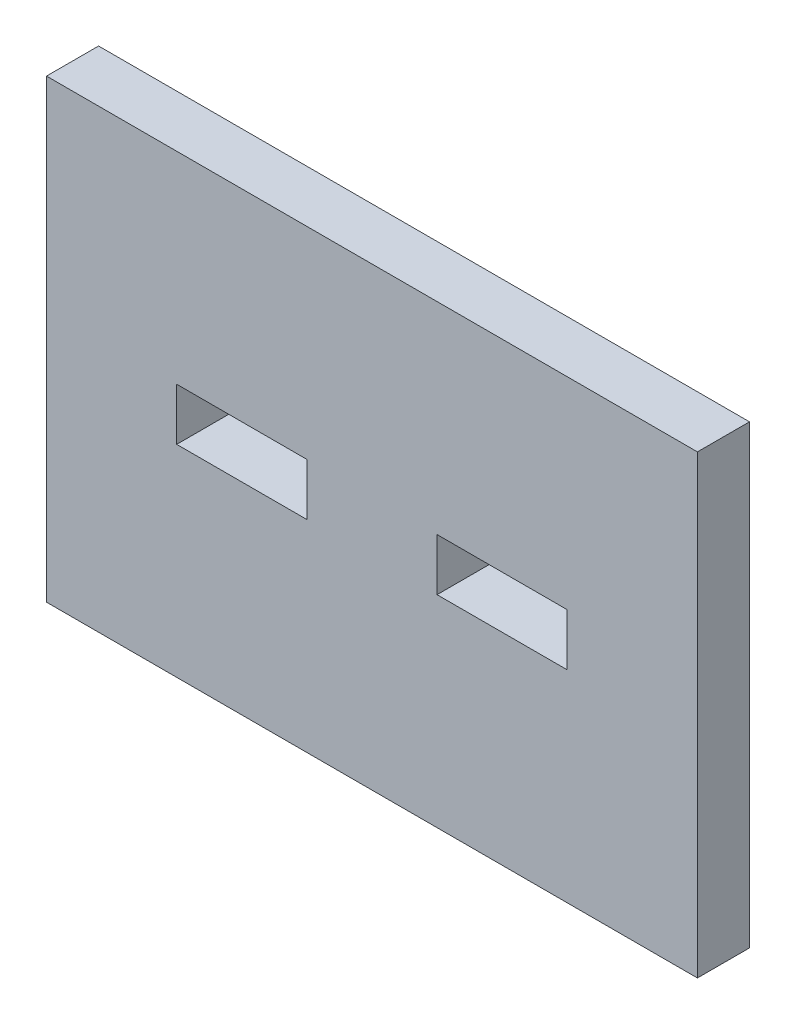
ISO-10303-21;
HEADER;
FILE_DESCRIPTION(('STEP AP214'),'2;1');
FILE_NAME('part.step','',(''),(''),'','','');
FILE_SCHEMA(('AUTOMOTIVE_DESIGN { 1 0 10303 214 1 1 1 1 }'));
ENDSEC;
DATA;
#1=APPLICATION_CONTEXT('core data for automotive mechanical design processes');
#2=APPLICATION_PROTOCOL_DEFINITION('international standard','automotive_design',2000,#1);
#3=PRODUCT_CONTEXT('',#1,'mechanical');
#4=PRODUCT('Part','Part','',(#3));
#5=PRODUCT_RELATED_PRODUCT_CATEGORY('part','',(#4));
#6=PRODUCT_DEFINITION_FORMATION('','',#4);
#7=PRODUCT_DEFINITION_CONTEXT('part definition',#1,'design');
#8=PRODUCT_DEFINITION('design','',#6,#7);
#9=PRODUCT_DEFINITION_SHAPE('','',#8);
#10=(LENGTH_UNIT() NAMED_UNIT(*) SI_UNIT(.MILLI.,.METRE.));
#11=(NAMED_UNIT(*) PLANE_ANGLE_UNIT() SI_UNIT($,.RADIAN.));
#12=(NAMED_UNIT(*) SI_UNIT($,.STERADIAN.) SOLID_ANGLE_UNIT());
#13=UNCERTAINTY_MEASURE_WITH_UNIT(LENGTH_MEASURE(1.E-05),#10,'distance_accuracy_value','');
#14=(GEOMETRIC_REPRESENTATION_CONTEXT(3) GLOBAL_UNCERTAINTY_ASSIGNED_CONTEXT((#13)) GLOBAL_UNIT_ASSIGNED_CONTEXT((#10,
#11,#12)) REPRESENTATION_CONTEXT('',''));
#15=CARTESIAN_POINT('',(0.,0.,0.));
#16=DIRECTION('',(0.,0.,1.));
#17=DIRECTION('',(1.,0.,0.));
#18=AXIS2_PLACEMENT_3D('',#15,#16,#17);
#19=CARTESIAN_POINT('',(0.,0.,4.));
#20=DIRECTION('',(1.,0.,0.));
#21=DIRECTION('',(0.,0.,-1.));
#22=AXIS2_PLACEMENT_3D('',#19,#20,#21);
#23=PLANE('',#22);
#24=DIRECTION('',(0.,-1.,0.));
#25=VECTOR('',#24,1.);
#26=CARTESIAN_POINT('',(0.,0.,0.));
#27=LINE('',#26,#25);
#28=CARTESIAN_POINT('',(0.,35.,0.));
#29=VERTEX_POINT('',#28);
#30=CARTESIAN_POINT('',(0.,0.,0.));
#31=VERTEX_POINT('',#30);
#32=EDGE_CURVE('E181',#29,#31,#27,.T.);
#33=ORIENTED_EDGE('',*,*,#32,.T.);
#34=DIRECTION('',(0.,0.,-1.));
#35=VECTOR('',#34,1.);
#36=CARTESIAN_POINT('',(0.,0.,4.));
#37=LINE('',#36,#35);
#38=CARTESIAN_POINT('',(0.,0.,4.));
#39=VERTEX_POINT('',#38);
#40=EDGE_CURVE('E11',#39,#31,#37,.T.);
#41=ORIENTED_EDGE('',*,*,#40,.F.);
#42=DIRECTION('',(0.,-1.,0.));
#43=VECTOR('',#42,1.);
#44=CARTESIAN_POINT('',(0.,0.,4.));
#45=LINE('',#44,#43);
#46=CARTESIAN_POINT('',(0.,35.,4.));
#47=VERTEX_POINT('',#46);
#48=EDGE_CURVE('E188',#47,#39,#45,.T.);
#49=ORIENTED_EDGE('',*,*,#48,.F.);
#50=DIRECTION('',(0.,0.,-1.));
#51=VECTOR('',#50,1.);
#52=CARTESIAN_POINT('',(0.,35.,4.));
#53=LINE('',#52,#51);
#54=EDGE_CURVE('E198',#47,#29,#53,.T.);
#55=ORIENTED_EDGE('',*,*,#54,.T.);
#56=EDGE_LOOP('',(#33,#41,#49,#55));
#57=FACE_BOUND('',#56,.T.);
#58=ADVANCED_FACE('F31',(#57),#23,.F.);
#59=CARTESIAN_POINT('',(0.,0.,4.));
#60=DIRECTION('',(0.,1.,0.));
#61=DIRECTION('',(0.,0.,1.));
#62=AXIS2_PLACEMENT_3D('',#59,#60,#61);
#63=PLANE('',#62);
#64=DIRECTION('',(1.,0.,0.));
#65=VECTOR('',#64,1.);
#66=CARTESIAN_POINT('',(0.,0.,0.));
#67=LINE('',#66,#65);
#68=CARTESIAN_POINT('',(50.,0.,0.));
#69=VERTEX_POINT('',#68);
#70=EDGE_CURVE('E201',#31,#69,#67,.T.);
#71=ORIENTED_EDGE('',*,*,#70,.T.);
#72=DIRECTION('',(0.,0.,-1.));
#73=VECTOR('',#72,1.);
#74=CARTESIAN_POINT('',(50.,0.,4.));
#75=LINE('',#74,#73);
#76=CARTESIAN_POINT('',(50.,0.,4.));
#77=VERTEX_POINT('',#76);
#78=EDGE_CURVE('E38',#77,#69,#75,.T.);
#79=ORIENTED_EDGE('',*,*,#78,.F.);
#80=DIRECTION('',(1.,0.,0.));
#81=VECTOR('',#80,1.);
#82=CARTESIAN_POINT('',(0.,0.,4.));
#83=LINE('',#82,#81);
#84=EDGE_CURVE('E191',#39,#77,#83,.T.);
#85=ORIENTED_EDGE('',*,*,#84,.F.);
#86=ORIENTED_EDGE('',*,*,#40,.T.);
#87=EDGE_LOOP('',(#71,#79,#85,#86));
#88=FACE_BOUND('',#87,.T.);
#89=ADVANCED_FACE('F230',(#88),#63,.F.);
#90=CARTESIAN_POINT('',(50.,0.,4.));
#91=DIRECTION('',(-1.,0.,0.));
#92=DIRECTION('',(0.,0.,1.));
#93=AXIS2_PLACEMENT_3D('',#90,#91,#92);
#94=PLANE('',#93);
#95=DIRECTION('',(0.,1.,0.));
#96=VECTOR('',#95,1.);
#97=CARTESIAN_POINT('',(50.,0.,0.));
#98=LINE('',#97,#96);
#99=CARTESIAN_POINT('',(50.,35.,0.));
#100=VERTEX_POINT('',#99);
#101=EDGE_CURVE('E203',#69,#100,#98,.T.);
#102=ORIENTED_EDGE('',*,*,#101,.T.);
#103=DIRECTION('',(0.,0.,-1.));
#104=VECTOR('',#103,1.);
#105=CARTESIAN_POINT('',(50.,35.,4.));
#106=LINE('',#105,#104);
#107=CARTESIAN_POINT('',(50.,35.,4.));
#108=VERTEX_POINT('',#107);
#109=EDGE_CURVE('E208',#108,#100,#106,.T.);
#110=ORIENTED_EDGE('',*,*,#109,.F.);
#111=DIRECTION('',(0.,1.,0.));
#112=VECTOR('',#111,1.);
#113=CARTESIAN_POINT('',(50.,0.,4.));
#114=LINE('',#113,#112);
#115=EDGE_CURVE('E194',#77,#108,#114,.T.);
#116=ORIENTED_EDGE('',*,*,#115,.F.);
#117=ORIENTED_EDGE('',*,*,#78,.T.);
#118=EDGE_LOOP('',(#102,#110,#116,#117));
#119=FACE_BOUND('',#118,.T.);
#120=ADVANCED_FACE('F215',(#119),#94,.F.);
#121=CARTESIAN_POINT('',(0.,35.,4.));
#122=DIRECTION('',(0.,-1.,0.));
#123=DIRECTION('',(0.,0.,-1.));
#124=AXIS2_PLACEMENT_3D('',#121,#122,#123);
#125=PLANE('',#124);
#126=DIRECTION('',(-1.,0.,0.));
#127=VECTOR('',#126,1.);
#128=CARTESIAN_POINT('',(0.,35.,0.));
#129=LINE('',#128,#127);
#130=EDGE_CURVE('E192',#100,#29,#129,.T.);
#131=ORIENTED_EDGE('',*,*,#130,.T.);
#132=ORIENTED_EDGE('',*,*,#54,.F.);
#133=DIRECTION('',(-1.,0.,0.));
#134=VECTOR('',#133,1.);
#135=CARTESIAN_POINT('',(0.,35.,4.));
#136=LINE('',#135,#134);
#137=EDGE_CURVE('E196',#108,#47,#136,.T.);
#138=ORIENTED_EDGE('',*,*,#137,.F.);
#139=ORIENTED_EDGE('',*,*,#109,.T.);
#140=EDGE_LOOP('',(#131,#132,#138,#139));
#141=FACE_BOUND('',#140,.T.);
#142=ADVANCED_FACE('F223',(#141),#125,.F.);
#143=CARTESIAN_POINT('',(0.,35.,4.));
#144=DIRECTION('',(0.,0.,-1.));
#145=DIRECTION('',(-1.,0.,0.));
#146=AXIS2_PLACEMENT_3D('',#143,#144,#145);
#147=PLANE('',#146);
#148=DIRECTION('',(-1.,0.,0.));
#149=VECTOR('',#148,1.);
#150=CARTESIAN_POINT('',(30.,19.5,4.));
#151=LINE('',#150,#149);
#152=CARTESIAN_POINT('',(40.,19.5,4.));
#153=VERTEX_POINT('',#152);
#154=CARTESIAN_POINT('',(30.,19.5,4.));
#155=VERTEX_POINT('',#154);
#156=EDGE_CURVE('E146',#153,#155,#151,.T.);
#157=ORIENTED_EDGE('',*,*,#156,.F.);
#158=DIRECTION('',(0.,1.,0.));
#159=VECTOR('',#158,1.);
#160=CARTESIAN_POINT('',(40.,19.5,4.));
#161=LINE('',#160,#159);
#162=CARTESIAN_POINT('',(40.,15.5,4.));
#163=VERTEX_POINT('',#162);
#164=EDGE_CURVE('E45',#163,#153,#161,.T.);
#165=ORIENTED_EDGE('',*,*,#164,.F.);
#166=DIRECTION('',(1.,0.,0.));
#167=VECTOR('',#166,1.);
#168=CARTESIAN_POINT('',(30.,15.5,4.));
#169=LINE('',#168,#167);
#170=CARTESIAN_POINT('',(30.,15.5,4.));
#171=VERTEX_POINT('',#170);
#172=EDGE_CURVE('E137',#171,#163,#169,.T.);
#173=ORIENTED_EDGE('',*,*,#172,.F.);
#174=DIRECTION('',(0.,-1.,0.));
#175=VECTOR('',#174,1.);
#176=CARTESIAN_POINT('',(30.,19.5,4.));
#177=LINE('',#176,#175);
#178=EDGE_CURVE('E140',#155,#171,#177,.T.);
#179=ORIENTED_EDGE('',*,*,#178,.F.);
#180=EDGE_LOOP('',(#157,#165,#173,#179));
#181=FACE_BOUND('',#180,.T.);
#182=DIRECTION('',(-1.,0.,0.));
#183=VECTOR('',#182,1.);
#184=CARTESIAN_POINT('',(10.,19.5,4.));
#185=LINE('',#184,#183);
#186=CARTESIAN_POINT('',(20.,19.5,4.));
#187=VERTEX_POINT('',#186);
#188=CARTESIAN_POINT('',(10.,19.5,4.));
#189=VERTEX_POINT('',#188);
#190=EDGE_CURVE('E171',#187,#189,#185,.T.);
#191=ORIENTED_EDGE('',*,*,#190,.F.);
#192=DIRECTION('',(0.,1.,0.));
#193=VECTOR('',#192,1.);
#194=CARTESIAN_POINT('',(20.,19.5,4.));
#195=LINE('',#194,#193);
#196=CARTESIAN_POINT('',(20.,15.5,4.));
#197=VERTEX_POINT('',#196);
#198=EDGE_CURVE('E152',#197,#187,#195,.T.);
#199=ORIENTED_EDGE('',*,*,#198,.F.);
#200=DIRECTION('',(1.,0.,0.));
#201=VECTOR('',#200,1.);
#202=CARTESIAN_POINT('',(10.,15.5,4.));
#203=LINE('',#202,#201);
#204=CARTESIAN_POINT('',(10.,15.5,4.));
#205=VERTEX_POINT('',#204);
#206=EDGE_CURVE('E160',#205,#197,#203,.T.);
#207=ORIENTED_EDGE('',*,*,#206,.F.);
#208=DIRECTION('',(0.,-1.,0.));
#209=VECTOR('',#208,1.);
#210=CARTESIAN_POINT('',(10.,19.5,4.));
#211=LINE('',#210,#209);
#212=EDGE_CURVE('E174',#189,#205,#211,.T.);
#213=ORIENTED_EDGE('',*,*,#212,.F.);
#214=EDGE_LOOP('',(#191,#199,#207,#213));
#215=FACE_BOUND('',#214,.T.);
#216=ORIENTED_EDGE('',*,*,#48,.T.);
#217=ORIENTED_EDGE('',*,*,#84,.T.);
#218=ORIENTED_EDGE('',*,*,#115,.T.);
#219=ORIENTED_EDGE('',*,*,#137,.T.);
#220=EDGE_LOOP('',(#216,#217,#218,#219));
#221=FACE_BOUND('',#220,.T.);
#222=ADVANCED_FACE('F229',(#181,#215,#221),#147,.F.);
#223=CARTESIAN_POINT('',(0.,35.,0.));
#224=DIRECTION('',(0.,0.,-1.));
#225=DIRECTION('',(-1.,0.,0.));
#226=AXIS2_PLACEMENT_3D('',#223,#224,#225);
#227=PLANE('',#226);
#228=DIRECTION('',(0.,1.,0.));
#229=VECTOR('',#228,1.);
#230=CARTESIAN_POINT('',(40.,19.5,0.));
#231=LINE('',#230,#229);
#232=CARTESIAN_POINT('',(40.,15.5,0.));
#233=VERTEX_POINT('',#232);
#234=CARTESIAN_POINT('',(40.,19.5,0.));
#235=VERTEX_POINT('',#234);
#236=EDGE_CURVE('E121',#233,#235,#231,.T.);
#237=ORIENTED_EDGE('',*,*,#236,.T.);
#238=DIRECTION('',(-1.,0.,0.));
#239=VECTOR('',#238,1.);
#240=CARTESIAN_POINT('',(30.,19.5,0.));
#241=LINE('',#240,#239);
#242=CARTESIAN_POINT('',(30.,19.5,0.));
#243=VERTEX_POINT('',#242);
#244=EDGE_CURVE('E130',#235,#243,#241,.T.);
#245=ORIENTED_EDGE('',*,*,#244,.T.);
#246=DIRECTION('',(0.,-1.,0.));
#247=VECTOR('',#246,1.);
#248=CARTESIAN_POINT('',(30.,19.5,0.));
#249=LINE('',#248,#247);
#250=CARTESIAN_POINT('',(30.,15.5,0.));
#251=VERTEX_POINT('',#250);
#252=EDGE_CURVE('E53',#243,#251,#249,.T.);
#253=ORIENTED_EDGE('',*,*,#252,.T.);
#254=DIRECTION('',(1.,0.,0.));
#255=VECTOR('',#254,1.);
#256=CARTESIAN_POINT('',(30.,15.5,0.));
#257=LINE('',#256,#255);
#258=EDGE_CURVE('E127',#251,#233,#257,.T.);
#259=ORIENTED_EDGE('',*,*,#258,.T.);
#260=EDGE_LOOP('',(#237,#245,#253,#259));
#261=FACE_BOUND('',#260,.T.);
#262=DIRECTION('',(0.,1.,0.));
#263=VECTOR('',#262,1.);
#264=CARTESIAN_POINT('',(20.,19.5,0.));
#265=LINE('',#264,#263);
#266=CARTESIAN_POINT('',(20.,15.5,0.));
#267=VERTEX_POINT('',#266);
#268=CARTESIAN_POINT('',(20.,19.5,0.));
#269=VERTEX_POINT('',#268);
#270=EDGE_CURVE('E156',#267,#269,#265,.T.);
#271=ORIENTED_EDGE('',*,*,#270,.T.);
#272=DIRECTION('',(-1.,0.,0.));
#273=VECTOR('',#272,1.);
#274=CARTESIAN_POINT('',(10.,19.5,0.));
#275=LINE('',#274,#273);
#276=CARTESIAN_POINT('',(10.,19.5,0.));
#277=VERTEX_POINT('',#276);
#278=EDGE_CURVE('E159',#269,#277,#275,.T.);
#279=ORIENTED_EDGE('',*,*,#278,.T.);
#280=DIRECTION('',(0.,-1.,0.));
#281=VECTOR('',#280,1.);
#282=CARTESIAN_POINT('',(10.,19.5,0.));
#283=LINE('',#282,#281);
#284=CARTESIAN_POINT('',(10.,15.5,0.));
#285=VERTEX_POINT('',#284);
#286=EDGE_CURVE('E163',#277,#285,#283,.T.);
#287=ORIENTED_EDGE('',*,*,#286,.T.);
#288=DIRECTION('',(1.,0.,0.));
#289=VECTOR('',#288,1.);
#290=CARTESIAN_POINT('',(10.,15.5,0.));
#291=LINE('',#290,#289);
#292=EDGE_CURVE('E166',#285,#267,#291,.T.);
#293=ORIENTED_EDGE('',*,*,#292,.T.);
#294=EDGE_LOOP('',(#271,#279,#287,#293));
#295=FACE_BOUND('',#294,.T.);
#296=ORIENTED_EDGE('',*,*,#32,.F.);
#297=ORIENTED_EDGE('',*,*,#130,.F.);
#298=ORIENTED_EDGE('',*,*,#101,.F.);
#299=ORIENTED_EDGE('',*,*,#70,.F.);
#300=EDGE_LOOP('',(#296,#297,#298,#299));
#301=FACE_BOUND('',#300,.T.);
#302=ADVANCED_FACE('F134',(#261,#295,#301),#227,.T.);
#303=CARTESIAN_POINT('',(20.,19.5,0.));
#304=DIRECTION('',(1.,0.,0.));
#305=DIRECTION('',(0.,0.,-1.));
#306=AXIS2_PLACEMENT_3D('',#303,#304,#305);
#307=PLANE('',#306);
#308=ORIENTED_EDGE('',*,*,#198,.T.);
#309=DIRECTION('',(0.,0.,1.));
#310=VECTOR('',#309,1.);
#311=CARTESIAN_POINT('',(20.,19.5,0.));
#312=LINE('',#311,#310);
#313=EDGE_CURVE('E169',#269,#187,#312,.T.);
#314=ORIENTED_EDGE('',*,*,#313,.F.);
#315=ORIENTED_EDGE('',*,*,#270,.F.);
#316=DIRECTION('',(0.,0.,1.));
#317=VECTOR('',#316,1.);
#318=CARTESIAN_POINT('',(20.,15.5,0.));
#319=LINE('',#318,#317);
#320=EDGE_CURVE('E179',#267,#197,#319,.T.);
#321=ORIENTED_EDGE('',*,*,#320,.T.);
#322=EDGE_LOOP('',(#308,#314,#315,#321));
#323=FACE_BOUND('',#322,.T.);
#324=ADVANCED_FACE('F242',(#323),#307,.F.);
#325=CARTESIAN_POINT('',(10.,15.5,0.));
#326=DIRECTION('',(0.,-1.,0.));
#327=DIRECTION('',(0.,0.,-1.));
#328=AXIS2_PLACEMENT_3D('',#325,#326,#327);
#329=PLANE('',#328);
#330=ORIENTED_EDGE('',*,*,#206,.T.);
#331=ORIENTED_EDGE('',*,*,#320,.F.);
#332=ORIENTED_EDGE('',*,*,#292,.F.);
#333=DIRECTION('',(0.,0.,1.));
#334=VECTOR('',#333,1.);
#335=CARTESIAN_POINT('',(10.,15.5,0.));
#336=LINE('',#335,#334);
#337=EDGE_CURVE('E182',#285,#205,#336,.T.);
#338=ORIENTED_EDGE('',*,*,#337,.T.);
#339=EDGE_LOOP('',(#330,#331,#332,#338));
#340=FACE_BOUND('',#339,.T.);
#341=ADVANCED_FACE('F248',(#340),#329,.F.);
#342=CARTESIAN_POINT('',(10.,19.5,0.));
#343=DIRECTION('',(-1.,0.,0.));
#344=DIRECTION('',(0.,0.,1.));
#345=AXIS2_PLACEMENT_3D('',#342,#343,#344);
#346=PLANE('',#345);
#347=ORIENTED_EDGE('',*,*,#212,.T.);
#348=ORIENTED_EDGE('',*,*,#337,.F.);
#349=ORIENTED_EDGE('',*,*,#286,.F.);
#350=DIRECTION('',(0.,0.,1.));
#351=VECTOR('',#350,1.);
#352=CARTESIAN_POINT('',(10.,19.5,0.));
#353=LINE('',#352,#351);
#354=EDGE_CURVE('E184',#277,#189,#353,.T.);
#355=ORIENTED_EDGE('',*,*,#354,.T.);
#356=EDGE_LOOP('',(#347,#348,#349,#355));
#357=FACE_BOUND('',#356,.T.);
#358=ADVANCED_FACE('F253',(#357),#346,.F.);
#359=CARTESIAN_POINT('',(10.,19.5,0.));
#360=DIRECTION('',(0.,1.,0.));
#361=DIRECTION('',(0.,0.,1.));
#362=AXIS2_PLACEMENT_3D('',#359,#360,#361);
#363=PLANE('',#362);
#364=ORIENTED_EDGE('',*,*,#190,.T.);
#365=ORIENTED_EDGE('',*,*,#354,.F.);
#366=ORIENTED_EDGE('',*,*,#278,.F.);
#367=ORIENTED_EDGE('',*,*,#313,.T.);
#368=EDGE_LOOP('',(#364,#365,#366,#367));
#369=FACE_BOUND('',#368,.T.);
#370=ADVANCED_FACE('F250',(#369),#363,.F.);
#371=CARTESIAN_POINT('',(40.,19.5,0.));
#372=DIRECTION('',(1.,0.,0.));
#373=DIRECTION('',(0.,0.,-1.));
#374=AXIS2_PLACEMENT_3D('',#371,#372,#373);
#375=PLANE('',#374);
#376=ORIENTED_EDGE('',*,*,#164,.T.);
#377=DIRECTION('',(0.,0.,1.));
#378=VECTOR('',#377,1.);
#379=CARTESIAN_POINT('',(40.,19.5,0.));
#380=LINE('',#379,#378);
#381=EDGE_CURVE('E117',#235,#153,#380,.T.);
#382=ORIENTED_EDGE('',*,*,#381,.F.);
#383=ORIENTED_EDGE('',*,*,#236,.F.);
#384=DIRECTION('',(0.,0.,1.));
#385=VECTOR('',#384,1.);
#386=CARTESIAN_POINT('',(40.,15.5,0.));
#387=LINE('',#386,#385);
#388=EDGE_CURVE('E150',#233,#163,#387,.T.);
#389=ORIENTED_EDGE('',*,*,#388,.T.);
#390=EDGE_LOOP('',(#376,#382,#383,#389));
#391=FACE_BOUND('',#390,.T.);
#392=ADVANCED_FACE('F119',(#391),#375,.F.);
#393=CARTESIAN_POINT('',(30.,15.5,0.));
#394=DIRECTION('',(0.,-1.,0.));
#395=DIRECTION('',(0.,0.,-1.));
#396=AXIS2_PLACEMENT_3D('',#393,#394,#395);
#397=PLANE('',#396);
#398=ORIENTED_EDGE('',*,*,#172,.T.);
#399=ORIENTED_EDGE('',*,*,#388,.F.);
#400=ORIENTED_EDGE('',*,*,#258,.F.);
#401=DIRECTION('',(0.,0.,1.));
#402=VECTOR('',#401,1.);
#403=CARTESIAN_POINT('',(30.,15.5,0.));
#404=LINE('',#403,#402);
#405=EDGE_CURVE('E153',#251,#171,#404,.T.);
#406=ORIENTED_EDGE('',*,*,#405,.T.);
#407=EDGE_LOOP('',(#398,#399,#400,#406));
#408=FACE_BOUND('',#407,.T.);
#409=ADVANCED_FACE('F263',(#408),#397,.F.);
#410=CARTESIAN_POINT('',(30.,19.5,0.));
#411=DIRECTION('',(-1.,0.,0.));
#412=DIRECTION('',(0.,0.,1.));
#413=AXIS2_PLACEMENT_3D('',#410,#411,#412);
#414=PLANE('',#413);
#415=ORIENTED_EDGE('',*,*,#178,.T.);
#416=ORIENTED_EDGE('',*,*,#405,.F.);
#417=ORIENTED_EDGE('',*,*,#252,.F.);
#418=DIRECTION('',(0.,0.,1.));
#419=VECTOR('',#418,1.);
#420=CARTESIAN_POINT('',(30.,19.5,0.));
#421=LINE('',#420,#419);
#422=EDGE_CURVE('E126',#243,#155,#421,.T.);
#423=ORIENTED_EDGE('',*,*,#422,.T.);
#424=EDGE_LOOP('',(#415,#416,#417,#423));
#425=FACE_BOUND('',#424,.T.);
#426=ADVANCED_FACE('F266',(#425),#414,.F.);
#427=CARTESIAN_POINT('',(30.,19.5,0.));
#428=DIRECTION('',(0.,1.,0.));
#429=DIRECTION('',(0.,0.,1.));
#430=AXIS2_PLACEMENT_3D('',#427,#428,#429);
#431=PLANE('',#430);
#432=ORIENTED_EDGE('',*,*,#156,.T.);
#433=ORIENTED_EDGE('',*,*,#422,.F.);
#434=ORIENTED_EDGE('',*,*,#244,.F.);
#435=ORIENTED_EDGE('',*,*,#381,.T.);
#436=EDGE_LOOP('',(#432,#433,#434,#435));
#437=FACE_BOUND('',#436,.T.);
#438=ADVANCED_FACE('F131',(#437),#431,.F.);
#439=CLOSED_SHELL('',(#58,#89,#120,#142,#222,#302,#324,#341,#358,#370,#392,#409,#426,#438));
#440=MANIFOLD_SOLID_BREP('B2',#439);
#441=ADVANCED_BREP_SHAPE_REPRESENTATION('',(#18,#440),#14);
#442=SHAPE_DEFINITION_REPRESENTATION(#9,#441);
ENDSEC;
END-ISO-10303-21;
